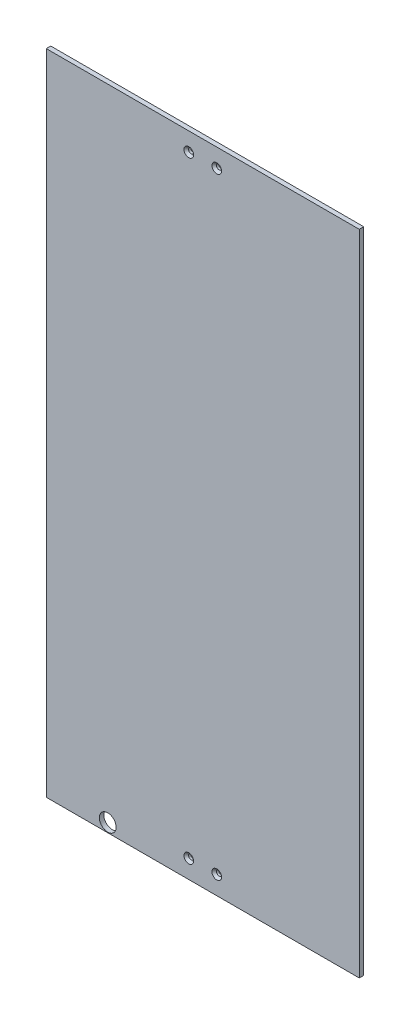
ISO-10303-21;
HEADER;
FILE_DESCRIPTION(('STEP AP214'),'2;1');
FILE_NAME('part.step','',(''),(''),'','','');
FILE_SCHEMA(('AUTOMOTIVE_DESIGN { 1 0 10303 214 1 1 1 1 }'));
ENDSEC;
DATA;
#1=APPLICATION_CONTEXT('core data for automotive mechanical design processes');
#2=APPLICATION_PROTOCOL_DEFINITION('international standard','automotive_design',2000,#1);
#3=PRODUCT_CONTEXT('',#1,'mechanical');
#4=PRODUCT('Part','Part','',(#3));
#5=PRODUCT_RELATED_PRODUCT_CATEGORY('part','',(#4));
#6=PRODUCT_DEFINITION_FORMATION('','',#4);
#7=PRODUCT_DEFINITION_CONTEXT('part definition',#1,'design');
#8=PRODUCT_DEFINITION('design','',#6,#7);
#9=PRODUCT_DEFINITION_SHAPE('','',#8);
#10=(LENGTH_UNIT() NAMED_UNIT(*) SI_UNIT(.MILLI.,.METRE.));
#11=(NAMED_UNIT(*) PLANE_ANGLE_UNIT() SI_UNIT($,.RADIAN.));
#12=(NAMED_UNIT(*) SI_UNIT($,.STERADIAN.) SOLID_ANGLE_UNIT());
#13=UNCERTAINTY_MEASURE_WITH_UNIT(LENGTH_MEASURE(1.E-05),#10,'distance_accuracy_value','');
#14=(GEOMETRIC_REPRESENTATION_CONTEXT(3) GLOBAL_UNCERTAINTY_ASSIGNED_CONTEXT((#13)) GLOBAL_UNIT_ASSIGNED_CONTEXT((#10,
#11,#12)) REPRESENTATION_CONTEXT('',''));
#15=CARTESIAN_POINT('',(0.,0.,0.));
#16=DIRECTION('',(0.,0.,1.));
#17=DIRECTION('',(1.,0.,0.));
#18=AXIS2_PLACEMENT_3D('',#15,#16,#17);
#19=CARTESIAN_POINT('',(127.5,563.500000000001,4.00000000007594));
#20=DIRECTION('',(0.,0.,1.));
#21=DIRECTION('',(1.,0.,0.));
#22=AXIS2_PLACEMENT_3D('',#19,#20,#21);
#23=CONICAL_SURFACE('',#22,4.30000000005507,0.785398163397448);
#24=CARTESIAN_POINT('',(127.5,563.500000000001,4.0000000000191));
#25=DIRECTION('',(0.,0.,1.));
#26=DIRECTION('',(1.,0.,0.));
#27=AXIS2_PLACEMENT_3D('',#24,#25,#26);
#28=CIRCLE('',#27,4.29999999999822);
#29=CARTESIAN_POINT('',(131.799999999998,563.500000000001,4.0000000000191));
#30=VERTEX_POINT('',#29);
#31=EDGE_CURVE('E20',#30,#30,#28,.T.);
#32=ORIENTED_EDGE('',*,*,#31,.T.);
#33=EDGE_LOOP('',(#32));
#34=FACE_BOUND('',#33,.T.);
#35=CARTESIAN_POINT('',(127.5,563.500000000001,1.95));
#36=DIRECTION('',(0.,0.,1.));
#37=DIRECTION('',(1.,0.,0.));
#38=AXIS2_PLACEMENT_3D('',#35,#36,#37);
#39=CIRCLE('',#38,2.25);
#40=CARTESIAN_POINT('',(129.75,563.500000000001,1.95));
#41=VERTEX_POINT('',#40);
#42=EDGE_CURVE('E94',#41,#41,#39,.F.);
#43=ORIENTED_EDGE('',*,*,#42,.T.);
#44=EDGE_LOOP('',(#43));
#45=FACE_BOUND('',#44,.T.);
#46=ADVANCED_FACE('F17',(#34,#45),#23,.F.);
#47=CARTESIAN_POINT('',(152.5,563.500000000001,4.00000000013279));
#48=DIRECTION('',(0.,0.,1.));
#49=DIRECTION('',(1.,0.,0.));
#50=AXIS2_PLACEMENT_3D('',#47,#48,#49);
#51=CONICAL_SURFACE('',#50,4.30000000008918,0.785398163397448);
#52=CARTESIAN_POINT('',(152.5,563.500000000001,4.00000000007594));
#53=DIRECTION('',(0.,0.,1.));
#54=DIRECTION('',(1.,0.,0.));
#55=AXIS2_PLACEMENT_3D('',#52,#53,#54);
#56=CIRCLE('',#55,4.30000000003233);
#57=CARTESIAN_POINT('',(156.800000000032,563.500000000001,4.00000000007594));
#58=VERTEX_POINT('',#57);
#59=EDGE_CURVE('E120',#58,#58,#56,.T.);
#60=ORIENTED_EDGE('',*,*,#59,.T.);
#61=EDGE_LOOP('',(#60));
#62=FACE_BOUND('',#61,.T.);
#63=CARTESIAN_POINT('',(152.5,563.500000000001,1.95));
#64=DIRECTION('',(0.,0.,1.));
#65=DIRECTION('',(1.,0.,0.));
#66=AXIS2_PLACEMENT_3D('',#63,#64,#65);
#67=CIRCLE('',#66,2.25);
#68=CARTESIAN_POINT('',(154.75,563.500000000001,1.95));
#69=VERTEX_POINT('',#68);
#70=EDGE_CURVE('E91',#69,#69,#67,.F.);
#71=ORIENTED_EDGE('',*,*,#70,.T.);
#72=EDGE_LOOP('',(#71));
#73=FACE_BOUND('',#72,.T.);
#74=ADVANCED_FACE('F188',(#62,#73),#51,.F.);
#75=CARTESIAN_POINT('',(127.5,16.5000000000005,4.00000000007594));
#76=DIRECTION('',(0.,0.,1.));
#77=DIRECTION('',(1.,0.,0.));
#78=AXIS2_PLACEMENT_3D('',#75,#76,#77);
#79=CONICAL_SURFACE('',#78,4.30000000005507,0.785398163397448);
#80=CARTESIAN_POINT('',(127.5,16.5000000000005,4.0000000000191));
#81=DIRECTION('',(0.,0.,1.));
#82=DIRECTION('',(1.,0.,0.));
#83=AXIS2_PLACEMENT_3D('',#80,#81,#82);
#84=CIRCLE('',#83,4.29999999999822);
#85=CARTESIAN_POINT('',(131.799999999998,16.5000000000005,4.0000000000191));
#86=VERTEX_POINT('',#85);
#87=EDGE_CURVE('E118',#86,#86,#84,.T.);
#88=ORIENTED_EDGE('',*,*,#87,.T.);
#89=EDGE_LOOP('',(#88));
#90=FACE_BOUND('',#89,.T.);
#91=CARTESIAN_POINT('',(127.5,16.5000000000005,1.95));
#92=DIRECTION('',(0.,0.,1.));
#93=DIRECTION('',(1.,0.,0.));
#94=AXIS2_PLACEMENT_3D('',#91,#92,#93);
#95=CIRCLE('',#94,2.25);
#96=CARTESIAN_POINT('',(129.75,16.5000000000005,1.95));
#97=VERTEX_POINT('',#96);
#98=EDGE_CURVE('E88',#97,#97,#95,.F.);
#99=ORIENTED_EDGE('',*,*,#98,.T.);
#100=EDGE_LOOP('',(#99));
#101=FACE_BOUND('',#100,.T.);
#102=ADVANCED_FACE('F141',(#90,#101),#79,.F.);
#103=CARTESIAN_POINT('',(152.5,16.5000000000005,4.00000000013279));
#104=DIRECTION('',(0.,0.,1.));
#105=DIRECTION('',(1.,0.,0.));
#106=AXIS2_PLACEMENT_3D('',#103,#104,#105);
#107=CONICAL_SURFACE('',#106,4.30000000008918,0.785398163397448);
#108=CARTESIAN_POINT('',(152.5,16.5000000000005,4.00000000007594));
#109=DIRECTION('',(0.,0.,1.));
#110=DIRECTION('',(1.,0.,0.));
#111=AXIS2_PLACEMENT_3D('',#108,#109,#110);
#112=CIRCLE('',#111,4.30000000003233);
#113=CARTESIAN_POINT('',(156.800000000032,16.5000000000005,4.00000000007594));
#114=VERTEX_POINT('',#113);
#115=EDGE_CURVE('E97',#114,#114,#112,.T.);
#116=ORIENTED_EDGE('',*,*,#115,.T.);
#117=EDGE_LOOP('',(#116));
#118=FACE_BOUND('',#117,.T.);
#119=CARTESIAN_POINT('',(152.5,16.5000000000005,1.95));
#120=DIRECTION('',(0.,0.,1.));
#121=DIRECTION('',(1.,0.,0.));
#122=AXIS2_PLACEMENT_3D('',#119,#120,#121);
#123=CIRCLE('',#122,2.25);
#124=CARTESIAN_POINT('',(154.75,16.5000000000005,1.95));
#125=VERTEX_POINT('',#124);
#126=EDGE_CURVE('E85',#125,#125,#123,.F.);
#127=ORIENTED_EDGE('',*,*,#126,.T.);
#128=EDGE_LOOP('',(#127));
#129=FACE_BOUND('',#128,.T.);
#130=ADVANCED_FACE('F131',(#118,#129),#107,.F.);
#131=CARTESIAN_POINT('',(0.,0.,4.));
#132=DIRECTION('',(0.,0.,-1.));
#133=DIRECTION('',(-1.,0.,0.));
#134=AXIS2_PLACEMENT_3D('',#131,#132,#133);
#135=PLANE('',#134);
#136=DIRECTION('',(1.,0.,0.));
#137=VECTOR('',#136,1.);
#138=CARTESIAN_POINT('',(0.,0.,4.));
#139=LINE('',#138,#137);
#140=CARTESIAN_POINT('',(0.,0.,4.));
#141=VERTEX_POINT('',#140);
#142=CARTESIAN_POINT('',(280.,0.,4.));
#143=VERTEX_POINT('',#142);
#144=EDGE_CURVE('E303',#141,#143,#139,.T.);
#145=ORIENTED_EDGE('',*,*,#144,.T.);
#146=DIRECTION('',(0.,1.,0.));
#147=VECTOR('',#146,1.);
#148=CARTESIAN_POINT('',(280.,0.,4.));
#149=LINE('',#148,#147);
#150=CARTESIAN_POINT('',(280.,580.,4.));
#151=VERTEX_POINT('',#150);
#152=EDGE_CURVE('E55',#143,#151,#149,.T.);
#153=ORIENTED_EDGE('',*,*,#152,.T.);
#154=DIRECTION('',(1.,0.,0.));
#155=VECTOR('',#154,1.);
#156=CARTESIAN_POINT('',(0.,580.,4.));
#157=LINE('',#156,#155);
#158=CARTESIAN_POINT('',(0.,580.,4.));
#159=VERTEX_POINT('',#158);
#160=EDGE_CURVE('E57',#151,#159,#157,.F.);
#161=ORIENTED_EDGE('',*,*,#160,.T.);
#162=DIRECTION('',(0.,1.,0.));
#163=VECTOR('',#162,1.);
#164=CARTESIAN_POINT('',(0.,0.,4.));
#165=LINE('',#164,#163);
#166=EDGE_CURVE('E61',#159,#141,#165,.F.);
#167=ORIENTED_EDGE('',*,*,#166,.T.);
#168=EDGE_LOOP('',(#145,#153,#161,#167));
#169=FACE_BOUND('',#168,.T.);
#170=CARTESIAN_POINT('',(55.,8.00000000000001,4.));
#171=DIRECTION('',(0.,0.,1.));
#172=DIRECTION('',(1.,0.,0.));
#173=AXIS2_PLACEMENT_3D('',#170,#171,#172);
#174=CIRCLE('',#173,7.5);
#175=CARTESIAN_POINT('',(62.5,8.00000000000001,4.));
#176=VERTEX_POINT('',#175);
#177=EDGE_CURVE('E74',#176,#176,#174,.F.);
#178=ORIENTED_EDGE('',*,*,#177,.T.);
#179=EDGE_LOOP('',(#178));
#180=FACE_BOUND('',#179,.T.);
#181=ORIENTED_EDGE('',*,*,#115,.F.);
#182=EDGE_LOOP('',(#181));
#183=FACE_BOUND('',#182,.T.);
#184=ORIENTED_EDGE('',*,*,#87,.F.);
#185=EDGE_LOOP('',(#184));
#186=FACE_BOUND('',#185,.T.);
#187=ORIENTED_EDGE('',*,*,#59,.F.);
#188=EDGE_LOOP('',(#187));
#189=FACE_BOUND('',#188,.T.);
#190=ORIENTED_EDGE('',*,*,#31,.F.);
#191=EDGE_LOOP('',(#190));
#192=FACE_BOUND('',#191,.T.);
#193=ADVANCED_FACE('F59',(#169,#180,#183,#186,#189,#192),#135,.F.);
#194=CARTESIAN_POINT('',(127.5,563.500000000001,4.));
#195=DIRECTION('',(0.,0.,1.));
#196=DIRECTION('',(1.,0.,0.));
#197=AXIS2_PLACEMENT_3D('',#194,#195,#196);
#198=CYLINDRICAL_SURFACE('',#197,2.25);
#199=ORIENTED_EDGE('',*,*,#42,.F.);
#200=EDGE_LOOP('',(#199));
#201=FACE_BOUND('',#200,.T.);
#202=CARTESIAN_POINT('',(127.5,563.500000000001,0.));
#203=DIRECTION('',(0.,0.,1.));
#204=DIRECTION('',(1.,0.,0.));
#205=AXIS2_PLACEMENT_3D('',#202,#203,#204);
#206=CIRCLE('',#205,2.25);
#207=CARTESIAN_POINT('',(129.75,563.500000000001,0.));
#208=VERTEX_POINT('',#207);
#209=EDGE_CURVE('E111',#208,#208,#206,.T.);
#210=ORIENTED_EDGE('',*,*,#209,.F.);
#211=EDGE_LOOP('',(#210));
#212=FACE_BOUND('',#211,.T.);
#213=ADVANCED_FACE('F130',(#201,#212),#198,.F.);
#214=CARTESIAN_POINT('',(152.5,563.500000000001,4.));
#215=DIRECTION('',(0.,0.,1.));
#216=DIRECTION('',(1.,0.,0.));
#217=AXIS2_PLACEMENT_3D('',#214,#215,#216);
#218=CYLINDRICAL_SURFACE('',#217,2.25);
#219=ORIENTED_EDGE('',*,*,#70,.F.);
#220=EDGE_LOOP('',(#219));
#221=FACE_BOUND('',#220,.T.);
#222=CARTESIAN_POINT('',(152.5,563.500000000001,0.));
#223=DIRECTION('',(0.,0.,1.));
#224=DIRECTION('',(1.,0.,0.));
#225=AXIS2_PLACEMENT_3D('',#222,#223,#224);
#226=CIRCLE('',#225,2.25);
#227=CARTESIAN_POINT('',(154.75,563.500000000001,0.));
#228=VERTEX_POINT('',#227);
#229=EDGE_CURVE('E108',#228,#228,#226,.T.);
#230=ORIENTED_EDGE('',*,*,#229,.F.);
#231=EDGE_LOOP('',(#230));
#232=FACE_BOUND('',#231,.T.);
#233=ADVANCED_FACE('F138',(#221,#232),#218,.F.);
#234=CARTESIAN_POINT('',(127.5,16.5000000000005,4.));
#235=DIRECTION('',(0.,0.,1.));
#236=DIRECTION('',(1.,0.,0.));
#237=AXIS2_PLACEMENT_3D('',#234,#235,#236);
#238=CYLINDRICAL_SURFACE('',#237,2.25);
#239=ORIENTED_EDGE('',*,*,#98,.F.);
#240=EDGE_LOOP('',(#239));
#241=FACE_BOUND('',#240,.T.);
#242=CARTESIAN_POINT('',(127.5,16.5000000000005,0.));
#243=DIRECTION('',(0.,0.,1.));
#244=DIRECTION('',(1.,0.,0.));
#245=AXIS2_PLACEMENT_3D('',#242,#243,#244);
#246=CIRCLE('',#245,2.25);
#247=CARTESIAN_POINT('',(129.75,16.5000000000005,0.));
#248=VERTEX_POINT('',#247);
#249=EDGE_CURVE('E105',#248,#248,#246,.T.);
#250=ORIENTED_EDGE('',*,*,#249,.F.);
#251=EDGE_LOOP('',(#250));
#252=FACE_BOUND('',#251,.T.);
#253=ADVANCED_FACE('F171',(#241,#252),#238,.F.);
#254=CARTESIAN_POINT('',(152.5,16.5000000000005,4.));
#255=DIRECTION('',(0.,0.,1.));
#256=DIRECTION('',(1.,0.,0.));
#257=AXIS2_PLACEMENT_3D('',#254,#255,#256);
#258=CYLINDRICAL_SURFACE('',#257,2.25);
#259=ORIENTED_EDGE('',*,*,#126,.F.);
#260=EDGE_LOOP('',(#259));
#261=FACE_BOUND('',#260,.T.);
#262=CARTESIAN_POINT('',(152.5,16.5000000000005,0.));
#263=DIRECTION('',(0.,0.,1.));
#264=DIRECTION('',(1.,0.,0.));
#265=AXIS2_PLACEMENT_3D('',#262,#263,#264);
#266=CIRCLE('',#265,2.25);
#267=CARTESIAN_POINT('',(154.75,16.5000000000005,0.));
#268=VERTEX_POINT('',#267);
#269=EDGE_CURVE('E102',#268,#268,#266,.T.);
#270=ORIENTED_EDGE('',*,*,#269,.F.);
#271=EDGE_LOOP('',(#270));
#272=FACE_BOUND('',#271,.T.);
#273=ADVANCED_FACE('F167',(#261,#272),#258,.F.);
#274=CARTESIAN_POINT('',(55.,8.00000000000001,-6.));
#275=DIRECTION('',(0.,0.,1.));
#276=DIRECTION('',(1.,0.,0.));
#277=AXIS2_PLACEMENT_3D('',#274,#275,#276);
#278=CYLINDRICAL_SURFACE('',#277,7.5);
#279=CARTESIAN_POINT('',(55.,8.00000000000001,0.));
#280=DIRECTION('',(0.,0.,1.));
#281=DIRECTION('',(1.,0.,0.));
#282=AXIS2_PLACEMENT_3D('',#279,#280,#281);
#283=CIRCLE('',#282,7.5);
#284=CARTESIAN_POINT('',(62.5,8.00000000000001,0.));
#285=VERTEX_POINT('',#284);
#286=EDGE_CURVE('E98',#285,#285,#283,.T.);
#287=ORIENTED_EDGE('',*,*,#286,.F.);
#288=EDGE_LOOP('',(#287));
#289=FACE_BOUND('',#288,.T.);
#290=ORIENTED_EDGE('',*,*,#177,.F.);
#291=EDGE_LOOP('',(#290));
#292=FACE_BOUND('',#291,.T.);
#293=ADVANCED_FACE('F164',(#289,#292),#278,.F.);
#294=CARTESIAN_POINT('',(0.,0.,4.));
#295=DIRECTION('',(1.,0.,0.));
#296=DIRECTION('',(0.,0.,-1.));
#297=AXIS2_PLACEMENT_3D('',#294,#295,#296);
#298=PLANE('',#297);
#299=DIRECTION('',(0.,0.,1.));
#300=VECTOR('',#299,1.);
#301=CARTESIAN_POINT('',(0.,0.,4.));
#302=LINE('',#301,#300);
#303=CARTESIAN_POINT('',(0.,0.,0.));
#304=VERTEX_POINT('',#303);
#305=EDGE_CURVE('E72',#304,#141,#302,.T.);
#306=ORIENTED_EDGE('',*,*,#305,.T.);
#307=ORIENTED_EDGE('',*,*,#166,.F.);
#308=DIRECTION('',(0.,0.,-1.));
#309=VECTOR('',#308,1.);
#310=CARTESIAN_POINT('',(0.,580.,4.));
#311=LINE('',#310,#309);
#312=CARTESIAN_POINT('',(0.,580.,0.));
#313=VERTEX_POINT('',#312);
#314=EDGE_CURVE('E66',#159,#313,#311,.T.);
#315=ORIENTED_EDGE('',*,*,#314,.T.);
#316=DIRECTION('',(0.,1.,0.));
#317=VECTOR('',#316,1.);
#318=CARTESIAN_POINT('',(0.,0.,0.));
#319=LINE('',#318,#317);
#320=EDGE_CURVE('E101',#304,#313,#319,.T.);
#321=ORIENTED_EDGE('',*,*,#320,.F.);
#322=EDGE_LOOP('',(#306,#307,#315,#321));
#323=FACE_BOUND('',#322,.T.);
#324=ADVANCED_FACE('F69',(#323),#298,.F.);
#325=CARTESIAN_POINT('',(0.,580.,4.));
#326=DIRECTION('',(0.,-1.,0.));
#327=DIRECTION('',(0.,0.,-1.));
#328=AXIS2_PLACEMENT_3D('',#325,#326,#327);
#329=PLANE('',#328);
#330=ORIENTED_EDGE('',*,*,#314,.F.);
#331=ORIENTED_EDGE('',*,*,#160,.F.);
#332=DIRECTION('',(0.,0.,1.));
#333=VECTOR('',#332,1.);
#334=CARTESIAN_POINT('',(280.,580.,4.));
#335=LINE('',#334,#333);
#336=CARTESIAN_POINT('',(280.,580.,0.));
#337=VERTEX_POINT('',#336);
#338=EDGE_CURVE('E81',#151,#337,#335,.F.);
#339=ORIENTED_EDGE('',*,*,#338,.T.);
#340=DIRECTION('',(-1.,0.,0.));
#341=VECTOR('',#340,1.);
#342=CARTESIAN_POINT('',(0.,580.,0.));
#343=LINE('',#342,#341);
#344=EDGE_CURVE('E78',#313,#337,#343,.F.);
#345=ORIENTED_EDGE('',*,*,#344,.F.);
#346=EDGE_LOOP('',(#330,#331,#339,#345));
#347=FACE_BOUND('',#346,.T.);
#348=ADVANCED_FACE('F76',(#347),#329,.F.);
#349=CARTESIAN_POINT('',(280.,0.,4.));
#350=DIRECTION('',(-1.,0.,0.));
#351=DIRECTION('',(0.,0.,1.));
#352=AXIS2_PLACEMENT_3D('',#349,#350,#351);
#353=PLANE('',#352);
#354=ORIENTED_EDGE('',*,*,#338,.F.);
#355=ORIENTED_EDGE('',*,*,#152,.F.);
#356=DIRECTION('',(0.,0.,1.));
#357=VECTOR('',#356,1.);
#358=CARTESIAN_POINT('',(280.,0.,4.));
#359=LINE('',#358,#357);
#360=CARTESIAN_POINT('',(280.,0.,0.));
#361=VERTEX_POINT('',#360);
#362=EDGE_CURVE('E35',#143,#361,#359,.F.);
#363=ORIENTED_EDGE('',*,*,#362,.T.);
#364=DIRECTION('',(0.,1.,0.));
#365=VECTOR('',#364,1.);
#366=CARTESIAN_POINT('',(280.,0.,0.));
#367=LINE('',#366,#365);
#368=EDGE_CURVE('E26',#337,#361,#367,.F.);
#369=ORIENTED_EDGE('',*,*,#368,.F.);
#370=EDGE_LOOP('',(#354,#355,#363,#369));
#371=FACE_BOUND('',#370,.T.);
#372=ADVANCED_FACE('F152',(#371),#353,.F.);
#373=CARTESIAN_POINT('',(0.,0.,4.));
#374=DIRECTION('',(0.,1.,0.));
#375=DIRECTION('',(0.,0.,1.));
#376=AXIS2_PLACEMENT_3D('',#373,#374,#375);
#377=PLANE('',#376);
#378=ORIENTED_EDGE('',*,*,#362,.F.);
#379=ORIENTED_EDGE('',*,*,#144,.F.);
#380=ORIENTED_EDGE('',*,*,#305,.F.);
#381=DIRECTION('',(-1.,0.,0.));
#382=VECTOR('',#381,1.);
#383=CARTESIAN_POINT('',(0.,0.,0.));
#384=LINE('',#383,#382);
#385=EDGE_CURVE('E11',#361,#304,#384,.T.);
#386=ORIENTED_EDGE('',*,*,#385,.F.);
#387=EDGE_LOOP('',(#378,#379,#380,#386));
#388=FACE_BOUND('',#387,.T.);
#389=ADVANCED_FACE('F146',(#388),#377,.F.);
#390=CARTESIAN_POINT('',(0.,0.,0.));
#391=DIRECTION('',(0.,0.,-1.));
#392=DIRECTION('',(-1.,0.,0.));
#393=AXIS2_PLACEMENT_3D('',#390,#391,#392);
#394=PLANE('',#393);
#395=ORIENTED_EDGE('',*,*,#368,.T.);
#396=ORIENTED_EDGE('',*,*,#385,.T.);
#397=ORIENTED_EDGE('',*,*,#320,.T.);
#398=ORIENTED_EDGE('',*,*,#344,.T.);
#399=EDGE_LOOP('',(#395,#396,#397,#398));
#400=FACE_BOUND('',#399,.T.);
#401=ORIENTED_EDGE('',*,*,#286,.T.);
#402=EDGE_LOOP('',(#401));
#403=FACE_BOUND('',#402,.T.);
#404=ORIENTED_EDGE('',*,*,#269,.T.);
#405=EDGE_LOOP('',(#404));
#406=FACE_BOUND('',#405,.T.);
#407=ORIENTED_EDGE('',*,*,#249,.T.);
#408=EDGE_LOOP('',(#407));
#409=FACE_BOUND('',#408,.T.);
#410=ORIENTED_EDGE('',*,*,#229,.T.);
#411=EDGE_LOOP('',(#410));
#412=FACE_BOUND('',#411,.T.);
#413=ORIENTED_EDGE('',*,*,#209,.T.);
#414=EDGE_LOOP('',(#413));
#415=FACE_BOUND('',#414,.T.);
#416=ADVANCED_FACE('F144',(#400,#403,#406,#409,#412,#415),#394,.T.);
#417=CLOSED_SHELL('',(#46,#74,#102,#130,#193,#213,#233,#253,#273,#293,#324,#348,#372,#389,#416));
#418=MANIFOLD_SOLID_BREP('B1',#417);
#419=ADVANCED_BREP_SHAPE_REPRESENTATION('',(#18,#418),#14);
#420=SHAPE_DEFINITION_REPRESENTATION(#9,#419);
ENDSEC;
END-ISO-10303-21;
